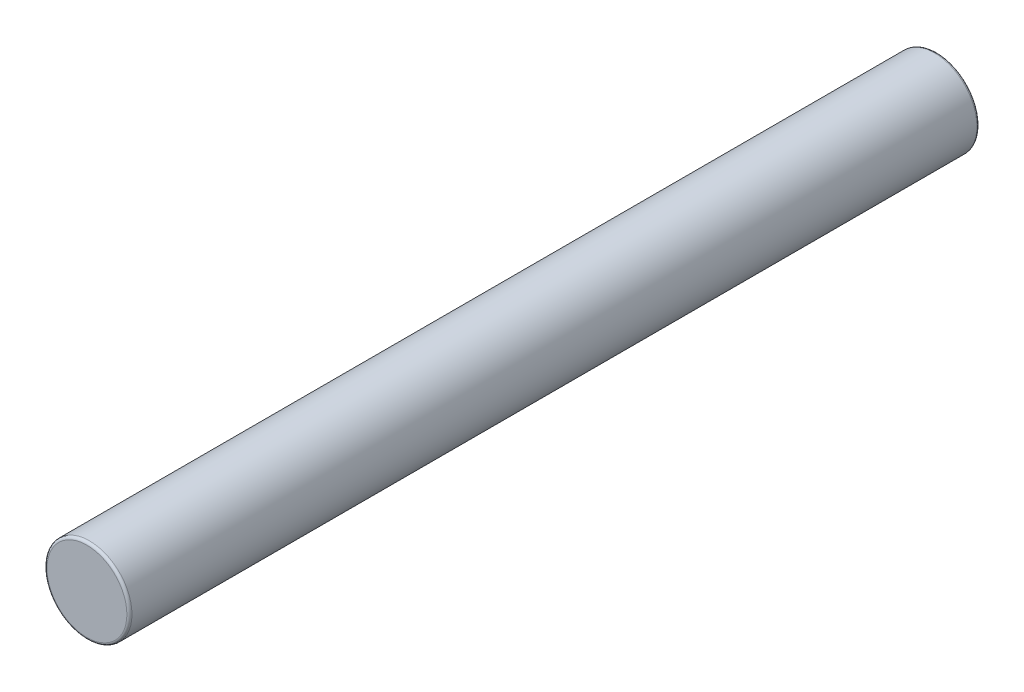
ISO-10303-21;
HEADER;
FILE_DESCRIPTION(('STEP AP214'),'2;1');
FILE_NAME('part.step','',(''),(''),'','','');
FILE_SCHEMA(('AUTOMOTIVE_DESIGN { 1 0 10303 214 1 1 1 1 }'));
ENDSEC;
DATA;
#1=APPLICATION_CONTEXT('core data for automotive mechanical design processes');
#2=APPLICATION_PROTOCOL_DEFINITION('international standard','automotive_design',2000,#1);
#3=PRODUCT_CONTEXT('',#1,'mechanical');
#4=PRODUCT('Part','Part','',(#3));
#5=PRODUCT_RELATED_PRODUCT_CATEGORY('part','',(#4));
#6=PRODUCT_DEFINITION_FORMATION('','',#4);
#7=PRODUCT_DEFINITION_CONTEXT('part definition',#1,'design');
#8=PRODUCT_DEFINITION('design','',#6,#7);
#9=PRODUCT_DEFINITION_SHAPE('','',#8);
#10=(LENGTH_UNIT() NAMED_UNIT(*) SI_UNIT(.MILLI.,.METRE.));
#11=(NAMED_UNIT(*) PLANE_ANGLE_UNIT() SI_UNIT($,.RADIAN.));
#12=(NAMED_UNIT(*) SI_UNIT($,.STERADIAN.) SOLID_ANGLE_UNIT());
#13=UNCERTAINTY_MEASURE_WITH_UNIT(LENGTH_MEASURE(1.E-05),#10,'distance_accuracy_value','');
#14=(GEOMETRIC_REPRESENTATION_CONTEXT(3) GLOBAL_UNCERTAINTY_ASSIGNED_CONTEXT((#13)) GLOBAL_UNIT_ASSIGNED_CONTEXT((#10,
#11,#12)) REPRESENTATION_CONTEXT('',''));
#15=CARTESIAN_POINT('',(0.,0.,0.));
#16=DIRECTION('',(0.,0.,1.));
#17=DIRECTION('',(1.,0.,0.));
#18=AXIS2_PLACEMENT_3D('',#15,#16,#17);
#19=CARTESIAN_POINT('',(0.,0.,50.));
#20=DIRECTION('',(0.,0.,-1.));
#21=DIRECTION('',(-1.,0.,0.));
#22=AXIS2_PLACEMENT_3D('',#19,#20,#21);
#23=CYLINDRICAL_SURFACE('',#22,5.);
#24=CARTESIAN_POINT('',(0.,0.,-49.7));
#25=DIRECTION('',(0.,0.,1.));
#26=DIRECTION('',(1.,0.,0.));
#27=AXIS2_PLACEMENT_3D('',#24,#25,#26);
#28=CIRCLE('',#27,5.);
#29=CARTESIAN_POINT('',(5.,0.,-49.7));
#30=VERTEX_POINT('',#29);
#31=EDGE_CURVE('E54',#30,#30,#28,.T.);
#32=ORIENTED_EDGE('',*,*,#31,.T.);
#33=EDGE_LOOP('',(#32));
#34=FACE_BOUND('',#33,.T.);
#35=CARTESIAN_POINT('',(0.,0.,49.7));
#36=DIRECTION('',(0.,0.,1.));
#37=DIRECTION('',(1.,0.,0.));
#38=AXIS2_PLACEMENT_3D('',#35,#36,#37);
#39=CIRCLE('',#38,5.);
#40=CARTESIAN_POINT('',(5.,0.,49.7));
#41=VERTEX_POINT('',#40);
#42=EDGE_CURVE('E59',#41,#41,#39,.F.);
#43=ORIENTED_EDGE('',*,*,#42,.T.);
#44=EDGE_LOOP('',(#43));
#45=FACE_BOUND('',#44,.T.);
#46=ADVANCED_FACE('F41',(#34,#45),#23,.T.);
#47=CARTESIAN_POINT('',(0.,0.,50.));
#48=DIRECTION('',(0.,0.,1.));
#49=DIRECTION('',(1.,0.,0.));
#50=AXIS2_PLACEMENT_3D('',#47,#48,#49);
#51=PLANE('',#50);
#52=CARTESIAN_POINT('',(0.,0.,50.));
#53=DIRECTION('',(0.,0.,1.));
#54=DIRECTION('',(1.,0.,0.));
#55=AXIS2_PLACEMENT_3D('',#52,#53,#54);
#56=CIRCLE('',#55,4.7);
#57=CARTESIAN_POINT('',(4.7,0.,50.));
#58=VERTEX_POINT('',#57);
#59=EDGE_CURVE('E10',#58,#58,#56,.T.);
#60=ORIENTED_EDGE('',*,*,#59,.T.);
#61=EDGE_LOOP('',(#60));
#62=FACE_BOUND('',#61,.T.);
#63=ADVANCED_FACE('F76',(#62),#51,.T.);
#64=CARTESIAN_POINT('',(0.,0.,-50.));
#65=DIRECTION('',(0.,0.,1.));
#66=DIRECTION('',(1.,0.,0.));
#67=AXIS2_PLACEMENT_3D('',#64,#65,#66);
#68=PLANE('',#67);
#69=CARTESIAN_POINT('',(0.,0.,-50.));
#70=DIRECTION('',(0.,0.,1.));
#71=DIRECTION('',(1.,0.,0.));
#72=AXIS2_PLACEMENT_3D('',#69,#70,#71);
#73=CIRCLE('',#72,4.7);
#74=CARTESIAN_POINT('',(4.7,0.,-50.));
#75=VERTEX_POINT('',#74);
#76=EDGE_CURVE('E49',#75,#75,#73,.F.);
#77=ORIENTED_EDGE('',*,*,#76,.T.);
#78=EDGE_LOOP('',(#77));
#79=FACE_BOUND('',#78,.T.);
#80=ADVANCED_FACE('F73',(#79),#68,.F.);
#81=CARTESIAN_POINT('',(0.,0.,-49.7));
#82=DIRECTION('',(0.,0.,1.));
#83=DIRECTION('',(1.,0.,0.));
#84=AXIS2_PLACEMENT_3D('',#81,#82,#83);
#85=TOROIDAL_SURFACE('',#84,4.7,0.3);
#86=ORIENTED_EDGE('',*,*,#76,.F.);
#87=EDGE_LOOP('',(#86));
#88=FACE_BOUND('',#87,.T.);
#89=ORIENTED_EDGE('',*,*,#31,.F.);
#90=EDGE_LOOP('',(#89));
#91=FACE_BOUND('',#90,.T.);
#92=ADVANCED_FACE('F69',(#88,#91),#85,.T.);
#93=CARTESIAN_POINT('',(0.,0.,49.7));
#94=DIRECTION('',(0.,0.,1.));
#95=DIRECTION('',(1.,0.,0.));
#96=AXIS2_PLACEMENT_3D('',#93,#94,#95);
#97=TOROIDAL_SURFACE('',#96,4.7,0.3);
#98=ORIENTED_EDGE('',*,*,#42,.F.);
#99=EDGE_LOOP('',(#98));
#100=FACE_BOUND('',#99,.T.);
#101=ORIENTED_EDGE('',*,*,#59,.F.);
#102=EDGE_LOOP('',(#101));
#103=FACE_BOUND('',#102,.T.);
#104=ADVANCED_FACE('F43',(#100,#103),#97,.T.);
#105=CLOSED_SHELL('',(#46,#63,#80,#92,#104));
#106=MANIFOLD_SOLID_BREP('B2',#105);
#107=ADVANCED_BREP_SHAPE_REPRESENTATION('',(#18,#106),#14);
#108=SHAPE_DEFINITION_REPRESENTATION(#9,#107);
ENDSEC;
END-ISO-10303-21;
